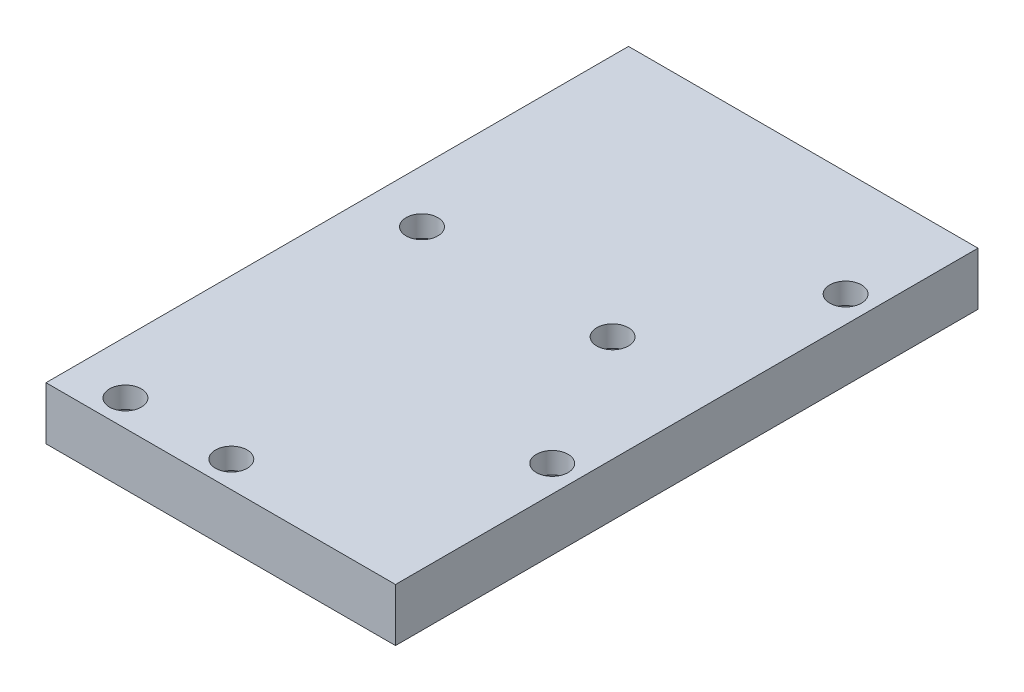
ISO-10303-21;
HEADER;
FILE_DESCRIPTION(('STEP AP214'),'2;1');
FILE_NAME('part.step','',(''),(''),'','','');
FILE_SCHEMA(('AUTOMOTIVE_DESIGN { 1 0 10303 214 1 1 1 1 }'));
ENDSEC;
DATA;
#1=APPLICATION_CONTEXT('core data for automotive mechanical design processes');
#2=APPLICATION_PROTOCOL_DEFINITION('international standard','automotive_design',2000,#1);
#3=PRODUCT_CONTEXT('',#1,'mechanical');
#4=PRODUCT('Part','Part','',(#3));
#5=PRODUCT_RELATED_PRODUCT_CATEGORY('part','',(#4));
#6=PRODUCT_DEFINITION_FORMATION('','',#4);
#7=PRODUCT_DEFINITION_CONTEXT('part definition',#1,'design');
#8=PRODUCT_DEFINITION('design','',#6,#7);
#9=PRODUCT_DEFINITION_SHAPE('','',#8);
#10=(LENGTH_UNIT() NAMED_UNIT(*) SI_UNIT(.MILLI.,.METRE.));
#11=(NAMED_UNIT(*) PLANE_ANGLE_UNIT() SI_UNIT($,.RADIAN.));
#12=(NAMED_UNIT(*) SI_UNIT($,.STERADIAN.) SOLID_ANGLE_UNIT());
#13=UNCERTAINTY_MEASURE_WITH_UNIT(LENGTH_MEASURE(1.E-05),#10,'distance_accuracy_value','');
#14=(GEOMETRIC_REPRESENTATION_CONTEXT(3) GLOBAL_UNCERTAINTY_ASSIGNED_CONTEXT((#13)) GLOBAL_UNIT_ASSIGNED_CONTEXT((#10,
#11,#12)) REPRESENTATION_CONTEXT('',''));
#15=CARTESIAN_POINT('',(0.,0.,0.));
#16=DIRECTION('',(0.,0.,1.));
#17=DIRECTION('',(1.,0.,0.));
#18=AXIS2_PLACEMENT_3D('',#15,#16,#17);
#19=CARTESIAN_POINT('',(0.,5.,0.));
#20=DIRECTION('',(0.,1.,0.));
#21=DIRECTION('',(0.,0.,1.));
#22=AXIS2_PLACEMENT_3D('',#19,#20,#21);
#23=PLANE('',#22);
#24=CARTESIAN_POINT('',(2.5,5.,10.));
#25=DIRECTION('',(0.,1.,0.));
#26=DIRECTION('',(0.,0.,1.));
#27=AXIS2_PLACEMENT_3D('',#24,#25,#26);
#28=CIRCLE('',#27,1.49999999999999);
#29=CARTESIAN_POINT('',(2.5,5.,11.5));
#30=VERTEX_POINT('',#29);
#31=EDGE_CURVE('E160',#30,#30,#28,.T.);
#32=ORIENTED_EDGE('',*,*,#31,.F.);
#33=EDGE_LOOP('',(#32));
#34=FACE_BOUND('',#33,.T.);
#35=CARTESIAN_POINT('',(2.5,5.,37.701964886511));
#36=DIRECTION('',(0.,1.,0.));
#37=DIRECTION('',(0.,0.,1.));
#38=AXIS2_PLACEMENT_3D('',#35,#36,#37);
#39=CIRCLE('',#38,1.5);
#40=CARTESIAN_POINT('',(2.5,5.,39.201964886511));
#41=VERTEX_POINT('',#40);
#42=EDGE_CURVE('E163',#41,#41,#39,.T.);
#43=ORIENTED_EDGE('',*,*,#42,.F.);
#44=EDGE_LOOP('',(#43));
#45=FACE_BOUND('',#44,.T.);
#46=CARTESIAN_POINT('',(-13.,5.,52.5));
#47=DIRECTION('',(0.,1.,0.));
#48=DIRECTION('',(0.,0.,1.));
#49=AXIS2_PLACEMENT_3D('',#46,#47,#48);
#50=CIRCLE('',#49,1.5);
#51=CARTESIAN_POINT('',(-13.,5.,54.));
#52=VERTEX_POINT('',#51);
#53=EDGE_CURVE('E179',#52,#52,#50,.T.);
#54=ORIENTED_EDGE('',*,*,#53,.F.);
#55=EDGE_LOOP('',(#54));
#56=FACE_BOUND('',#55,.T.);
#57=CARTESIAN_POINT('',(-5.,5.,24.5));
#58=DIRECTION('',(0.,1.,0.));
#59=DIRECTION('',(0.,0.,1.));
#60=AXIS2_PLACEMENT_3D('',#57,#58,#59);
#61=CIRCLE('',#60,1.5);
#62=CARTESIAN_POINT('',(-5.,5.,26.));
#63=VERTEX_POINT('',#62);
#64=EDGE_CURVE('E148',#63,#63,#61,.T.);
#65=ORIENTED_EDGE('',*,*,#64,.F.);
#66=EDGE_LOOP('',(#65));
#67=FACE_BOUND('',#66,.T.);
#68=DIRECTION('',(1.,0.,0.));
#69=VECTOR('',#68,1.);
#70=CARTESIAN_POINT('',(-28.,5.,55.));
#71=LINE('',#70,#69);
#72=CARTESIAN_POINT('',(-28.,5.,55.));
#73=VERTEX_POINT('',#72);
#74=CARTESIAN_POINT('',(5.,5.,55.));
#75=VERTEX_POINT('',#74);
#76=EDGE_CURVE('E128',#73,#75,#71,.T.);
#77=ORIENTED_EDGE('',*,*,#76,.T.);
#78=DIRECTION('',(0.,0.,1.));
#79=VECTOR('',#78,1.);
#80=CARTESIAN_POINT('',(5.,5.,55.));
#81=LINE('',#80,#79);
#82=CARTESIAN_POINT('',(5.,5.,0.));
#83=VERTEX_POINT('',#82);
#84=EDGE_CURVE('E159',#83,#75,#81,.T.);
#85=ORIENTED_EDGE('',*,*,#84,.F.);
#86=DIRECTION('',(1.,0.,0.));
#87=VECTOR('',#86,1.);
#88=CARTESIAN_POINT('',(-28.,5.,0.));
#89=LINE('',#88,#87);
#90=CARTESIAN_POINT('',(-28.,5.,0.));
#91=VERTEX_POINT('',#90);
#92=EDGE_CURVE('E189',#91,#83,#89,.T.);
#93=ORIENTED_EDGE('',*,*,#92,.F.);
#94=DIRECTION('',(0.,0.,-1.));
#95=VECTOR('',#94,1.);
#96=CARTESIAN_POINT('',(-28.,5.,55.));
#97=LINE('',#96,#95);
#98=EDGE_CURVE('E192',#73,#91,#97,.T.);
#99=ORIENTED_EDGE('',*,*,#98,.F.);
#100=EDGE_LOOP('',(#77,#85,#93,#99));
#101=FACE_BOUND('',#100,.T.);
#102=CARTESIAN_POINT('',(-23.,5.,24.5));
#103=DIRECTION('',(0.,1.,0.));
#104=DIRECTION('',(0.,0.,1.));
#105=AXIS2_PLACEMENT_3D('',#102,#103,#104);
#106=CIRCLE('',#105,1.5);
#107=CARTESIAN_POINT('',(-23.,5.,26.));
#108=VERTEX_POINT('',#107);
#109=EDGE_CURVE('E183',#108,#108,#106,.T.);
#110=ORIENTED_EDGE('',*,*,#109,.F.);
#111=EDGE_LOOP('',(#110));
#112=FACE_BOUND('',#111,.T.);
#113=CARTESIAN_POINT('',(-23.,5.,52.5));
#114=DIRECTION('',(0.,1.,0.));
#115=DIRECTION('',(0.,0.,1.));
#116=AXIS2_PLACEMENT_3D('',#113,#114,#115);
#117=CIRCLE('',#116,1.5);
#118=CARTESIAN_POINT('',(-23.,5.,54.));
#119=VERTEX_POINT('',#118);
#120=EDGE_CURVE('E176',#119,#119,#117,.T.);
#121=ORIENTED_EDGE('',*,*,#120,.F.);
#122=EDGE_LOOP('',(#121));
#123=FACE_BOUND('',#122,.T.);
#124=ADVANCED_FACE('F97',(#34,#45,#56,#67,#101,#112,#123),#23,.T.);
#125=CARTESIAN_POINT('',(0.,0.,0.));
#126=DIRECTION('',(0.,1.,0.));
#127=DIRECTION('',(0.,0.,1.));
#128=AXIS2_PLACEMENT_3D('',#125,#126,#127);
#129=PLANE('',#128);
#130=CARTESIAN_POINT('',(2.5,0.,10.));
#131=DIRECTION('',(0.,1.,0.));
#132=DIRECTION('',(0.,0.,1.));
#133=AXIS2_PLACEMENT_3D('',#130,#131,#132);
#134=CIRCLE('',#133,2.25);
#135=CARTESIAN_POINT('',(2.5,0.,12.25));
#136=VERTEX_POINT('',#135);
#137=EDGE_CURVE('E436',#136,#136,#134,.T.);
#138=ORIENTED_EDGE('',*,*,#137,.T.);
#139=EDGE_LOOP('',(#138));
#140=FACE_BOUND('',#139,.T.);
#141=CARTESIAN_POINT('',(-23.,0.,24.5));
#142=DIRECTION('',(0.,1.,0.));
#143=DIRECTION('',(0.,0.,1.));
#144=AXIS2_PLACEMENT_3D('',#141,#142,#143);
#145=CIRCLE('',#144,2.25);
#146=CARTESIAN_POINT('',(-23.,0.,26.75));
#147=VERTEX_POINT('',#146);
#148=EDGE_CURVE('E447',#147,#147,#145,.T.);
#149=ORIENTED_EDGE('',*,*,#148,.T.);
#150=EDGE_LOOP('',(#149));
#151=FACE_BOUND('',#150,.T.);
#152=CARTESIAN_POINT('',(-23.,0.,52.5));
#153=DIRECTION('',(0.,1.,0.));
#154=DIRECTION('',(0.,0.,1.));
#155=AXIS2_PLACEMENT_3D('',#152,#153,#154);
#156=CIRCLE('',#155,2.25);
#157=CARTESIAN_POINT('',(-23.,0.,54.75));
#158=VERTEX_POINT('',#157);
#159=EDGE_CURVE('E466',#158,#158,#156,.T.);
#160=ORIENTED_EDGE('',*,*,#159,.T.);
#161=EDGE_LOOP('',(#160));
#162=FACE_BOUND('',#161,.T.);
#163=CARTESIAN_POINT('',(-13.,0.,52.5));
#164=DIRECTION('',(0.,1.,0.));
#165=DIRECTION('',(0.,0.,1.));
#166=AXIS2_PLACEMENT_3D('',#163,#164,#165);
#167=CIRCLE('',#166,2.25);
#168=CARTESIAN_POINT('',(-13.,0.,54.75));
#169=VERTEX_POINT('',#168);
#170=EDGE_CURVE('E460',#169,#169,#167,.T.);
#171=ORIENTED_EDGE('',*,*,#170,.T.);
#172=EDGE_LOOP('',(#171));
#173=FACE_BOUND('',#172,.T.);
#174=CARTESIAN_POINT('',(2.5,0.,37.701964886511));
#175=DIRECTION('',(0.,1.,0.));
#176=DIRECTION('',(0.,0.,1.));
#177=AXIS2_PLACEMENT_3D('',#174,#175,#176);
#178=CIRCLE('',#177,2.25);
#179=CARTESIAN_POINT('',(2.5,0.,39.951964886511));
#180=VERTEX_POINT('',#179);
#181=EDGE_CURVE('E454',#180,#180,#178,.T.);
#182=ORIENTED_EDGE('',*,*,#181,.T.);
#183=EDGE_LOOP('',(#182));
#184=FACE_BOUND('',#183,.T.);
#185=CARTESIAN_POINT('',(-5.,0.,24.5));
#186=DIRECTION('',(0.,1.,0.));
#187=DIRECTION('',(0.,0.,1.));
#188=AXIS2_PLACEMENT_3D('',#185,#186,#187);
#189=CIRCLE('',#188,2.25);
#190=CARTESIAN_POINT('',(-5.,0.,26.75));
#191=VERTEX_POINT('',#190);
#192=EDGE_CURVE('E441',#191,#191,#189,.T.);
#193=ORIENTED_EDGE('',*,*,#192,.T.);
#194=EDGE_LOOP('',(#193));
#195=FACE_BOUND('',#194,.T.);
#196=DIRECTION('',(1.,0.,0.));
#197=VECTOR('',#196,1.);
#198=CARTESIAN_POINT('',(-28.,0.,55.));
#199=LINE('',#198,#197);
#200=CARTESIAN_POINT('',(-28.,0.,55.));
#201=VERTEX_POINT('',#200);
#202=CARTESIAN_POINT('',(5.,0.,55.));
#203=VERTEX_POINT('',#202);
#204=EDGE_CURVE('E141',#201,#203,#199,.T.);
#205=ORIENTED_EDGE('',*,*,#204,.F.);
#206=DIRECTION('',(0.,0.,-1.));
#207=VECTOR('',#206,1.);
#208=CARTESIAN_POINT('',(-28.,0.,55.));
#209=LINE('',#208,#207);
#210=CARTESIAN_POINT('',(-28.,0.,0.));
#211=VERTEX_POINT('',#210);
#212=EDGE_CURVE('E190',#201,#211,#209,.T.);
#213=ORIENTED_EDGE('',*,*,#212,.T.);
#214=DIRECTION('',(1.,0.,0.));
#215=VECTOR('',#214,1.);
#216=CARTESIAN_POINT('',(-28.,0.,0.));
#217=LINE('',#216,#215);
#218=CARTESIAN_POINT('',(5.,0.,0.));
#219=VERTEX_POINT('',#218);
#220=EDGE_CURVE('E147',#211,#219,#217,.T.);
#221=ORIENTED_EDGE('',*,*,#220,.T.);
#222=DIRECTION('',(0.,0.,-1.));
#223=VECTOR('',#222,1.);
#224=CARTESIAN_POINT('',(5.,0.,55.));
#225=LINE('',#224,#223);
#226=EDGE_CURVE('E151',#203,#219,#225,.T.);
#227=ORIENTED_EDGE('',*,*,#226,.F.);
#228=EDGE_LOOP('',(#205,#213,#221,#227));
#229=FACE_BOUND('',#228,.T.);
#230=ADVANCED_FACE('F152',(#140,#151,#162,#173,#184,#195,#229),#129,.F.);
#231=CARTESIAN_POINT('',(-28.,5.,55.));
#232=DIRECTION('',(0.,0.,-1.));
#233=DIRECTION('',(-1.,0.,0.));
#234=AXIS2_PLACEMENT_3D('',#231,#232,#233);
#235=PLANE('',#234);
#236=ORIENTED_EDGE('',*,*,#204,.T.);
#237=DIRECTION('',(0.,-1.,0.));
#238=VECTOR('',#237,1.);
#239=CARTESIAN_POINT('',(5.,5.,55.));
#240=LINE('',#239,#238);
#241=EDGE_CURVE('E144',#75,#203,#240,.T.);
#242=ORIENTED_EDGE('',*,*,#241,.F.);
#243=ORIENTED_EDGE('',*,*,#76,.F.);
#244=DIRECTION('',(0.,-1.,0.));
#245=VECTOR('',#244,1.);
#246=CARTESIAN_POINT('',(-28.,5.,55.));
#247=LINE('',#246,#245);
#248=EDGE_CURVE('E107',#73,#201,#247,.T.);
#249=ORIENTED_EDGE('',*,*,#248,.T.);
#250=EDGE_LOOP('',(#236,#242,#243,#249));
#251=FACE_BOUND('',#250,.T.);
#252=ADVANCED_FACE('F99',(#251),#235,.F.);
#253=CARTESIAN_POINT('',(-28.,5.,0.));
#254=DIRECTION('',(0.,0.,-1.));
#255=DIRECTION('',(-1.,0.,0.));
#256=AXIS2_PLACEMENT_3D('',#253,#254,#255);
#257=PLANE('',#256);
#258=ORIENTED_EDGE('',*,*,#220,.F.);
#259=DIRECTION('',(0.,-1.,0.));
#260=VECTOR('',#259,1.);
#261=CARTESIAN_POINT('',(-28.,5.,0.));
#262=LINE('',#261,#260);
#263=EDGE_CURVE('E13',#91,#211,#262,.T.);
#264=ORIENTED_EDGE('',*,*,#263,.F.);
#265=ORIENTED_EDGE('',*,*,#92,.T.);
#266=DIRECTION('',(0.,1.,0.));
#267=VECTOR('',#266,1.);
#268=CARTESIAN_POINT('',(5.,5.,0.));
#269=LINE('',#268,#267);
#270=EDGE_CURVE('E156',#219,#83,#269,.T.);
#271=ORIENTED_EDGE('',*,*,#270,.F.);
#272=EDGE_LOOP('',(#258,#264,#265,#271));
#273=FACE_BOUND('',#272,.T.);
#274=ADVANCED_FACE('F268',(#273),#257,.T.);
#275=CARTESIAN_POINT('',(-28.,5.,55.));
#276=DIRECTION('',(-1.,0.,0.));
#277=DIRECTION('',(0.,0.,1.));
#278=AXIS2_PLACEMENT_3D('',#275,#276,#277);
#279=PLANE('',#278);
#280=CARTESIAN_POINT('',(-28.,2.5,10.));
#281=DIRECTION('',(-1.,0.,0.));
#282=DIRECTION('',(0.,0.,1.));
#283=AXIS2_PLACEMENT_3D('',#280,#281,#282);
#284=CIRCLE('',#283,0.85);
#285=CARTESIAN_POINT('',(-28.,2.5,9.15));
#286=VERTEX_POINT('',#285);
#287=EDGE_CURVE('E180',#286,#286,#284,.F.);
#288=ORIENTED_EDGE('',*,*,#287,.T.);
#289=EDGE_LOOP('',(#288));
#290=FACE_BOUND('',#289,.T.);
#291=CARTESIAN_POINT('',(-28.,2.5,45.));
#292=DIRECTION('',(-1.,0.,0.));
#293=DIRECTION('',(0.,0.,1.));
#294=AXIS2_PLACEMENT_3D('',#291,#292,#293);
#295=CIRCLE('',#294,0.85);
#296=CARTESIAN_POINT('',(-28.,2.5,44.15));
#297=VERTEX_POINT('',#296);
#298=EDGE_CURVE('E173',#297,#297,#295,.F.);
#299=ORIENTED_EDGE('',*,*,#298,.T.);
#300=EDGE_LOOP('',(#299));
#301=FACE_BOUND('',#300,.T.);
#302=ORIENTED_EDGE('',*,*,#212,.F.);
#303=ORIENTED_EDGE('',*,*,#248,.F.);
#304=ORIENTED_EDGE('',*,*,#98,.T.);
#305=ORIENTED_EDGE('',*,*,#263,.T.);
#306=EDGE_LOOP('',(#302,#303,#304,#305));
#307=FACE_BOUND('',#306,.T.);
#308=ADVANCED_FACE('F261',(#290,#301,#307),#279,.T.);
#309=CARTESIAN_POINT('',(-5.,5.,24.5));
#310=DIRECTION('',(0.,-1.,0.));
#311=DIRECTION('',(0.,0.,-1.));
#312=AXIS2_PLACEMENT_3D('',#309,#310,#311);
#313=CYLINDRICAL_SURFACE('',#312,1.5);
#314=CARTESIAN_POINT('',(-5.,3.,24.5));
#315=DIRECTION('',(0.,1.,0.));
#316=DIRECTION('',(0.,0.,1.));
#317=AXIS2_PLACEMENT_3D('',#314,#315,#316);
#318=CIRCLE('',#317,1.5);
#319=CARTESIAN_POINT('',(-5.,3.,26.));
#320=VERTEX_POINT('',#319);
#321=EDGE_CURVE('E101',#320,#320,#318,.T.);
#322=ORIENTED_EDGE('',*,*,#321,.F.);
#323=EDGE_LOOP('',(#322));
#324=FACE_BOUND('',#323,.T.);
#325=ORIENTED_EDGE('',*,*,#64,.T.);
#326=EDGE_LOOP('',(#325));
#327=FACE_BOUND('',#326,.T.);
#328=ADVANCED_FACE('F258',(#324,#327),#313,.F.);
#329=CARTESIAN_POINT('',(-23.,5.,24.5));
#330=DIRECTION('',(0.,-1.,0.));
#331=DIRECTION('',(0.,0.,-1.));
#332=AXIS2_PLACEMENT_3D('',#329,#330,#331);
#333=CYLINDRICAL_SURFACE('',#332,1.5);
#334=CARTESIAN_POINT('',(-23.,3.,24.5));
#335=DIRECTION('',(0.,1.,0.));
#336=DIRECTION('',(0.,0.,1.));
#337=AXIS2_PLACEMENT_3D('',#334,#335,#336);
#338=CIRCLE('',#337,1.5);
#339=CARTESIAN_POINT('',(-23.,3.,26.));
#340=VERTEX_POINT('',#339);
#341=EDGE_CURVE('E213',#340,#340,#338,.T.);
#342=ORIENTED_EDGE('',*,*,#341,.F.);
#343=EDGE_LOOP('',(#342));
#344=FACE_BOUND('',#343,.T.);
#345=ORIENTED_EDGE('',*,*,#109,.T.);
#346=EDGE_LOOP('',(#345));
#347=FACE_BOUND('',#346,.T.);
#348=ADVANCED_FACE('F250',(#344,#347),#333,.F.);
#349=CARTESIAN_POINT('',(-13.,5.,52.5));
#350=DIRECTION('',(0.,-1.,0.));
#351=DIRECTION('',(0.,0.,-1.));
#352=AXIS2_PLACEMENT_3D('',#349,#350,#351);
#353=CYLINDRICAL_SURFACE('',#352,1.5);
#354=CARTESIAN_POINT('',(-13.,3.,52.5));
#355=DIRECTION('',(0.,1.,0.));
#356=DIRECTION('',(0.,0.,1.));
#357=AXIS2_PLACEMENT_3D('',#354,#355,#356);
#358=CIRCLE('',#357,1.5);
#359=CARTESIAN_POINT('',(-13.,3.,54.));
#360=VERTEX_POINT('',#359);
#361=EDGE_CURVE('E211',#360,#360,#358,.T.);
#362=ORIENTED_EDGE('',*,*,#361,.F.);
#363=EDGE_LOOP('',(#362));
#364=FACE_BOUND('',#363,.T.);
#365=ORIENTED_EDGE('',*,*,#53,.T.);
#366=EDGE_LOOP('',(#365));
#367=FACE_BOUND('',#366,.T.);
#368=ADVANCED_FACE('F240',(#364,#367),#353,.F.);
#369=CARTESIAN_POINT('',(-23.,5.,52.5));
#370=DIRECTION('',(0.,-1.,0.));
#371=DIRECTION('',(0.,0.,-1.));
#372=AXIS2_PLACEMENT_3D('',#369,#370,#371);
#373=CYLINDRICAL_SURFACE('',#372,1.5);
#374=CARTESIAN_POINT('',(-23.,3.,52.5));
#375=DIRECTION('',(0.,1.,0.));
#376=DIRECTION('',(0.,0.,1.));
#377=AXIS2_PLACEMENT_3D('',#374,#375,#376);
#378=CIRCLE('',#377,1.5);
#379=CARTESIAN_POINT('',(-23.,3.,54.));
#380=VERTEX_POINT('',#379);
#381=EDGE_CURVE('E208',#380,#380,#378,.T.);
#382=ORIENTED_EDGE('',*,*,#381,.F.);
#383=EDGE_LOOP('',(#382));
#384=FACE_BOUND('',#383,.T.);
#385=ORIENTED_EDGE('',*,*,#120,.T.);
#386=EDGE_LOOP('',(#385));
#387=FACE_BOUND('',#386,.T.);
#388=ADVANCED_FACE('F237',(#384,#387),#373,.F.);
#389=CARTESIAN_POINT('',(-28.000012,2.5,45.));
#390=DIRECTION('',(1.,0.,0.));
#391=DIRECTION('',(0.,0.,-1.));
#392=AXIS2_PLACEMENT_3D('',#389,#390,#391);
#393=CYLINDRICAL_SURFACE('',#392,0.85);
#394=CARTESIAN_POINT('',(-24.,2.5,45.));
#395=DIRECTION('',(-1.,0.,0.));
#396=DIRECTION('',(0.,0.,1.));
#397=AXIS2_PLACEMENT_3D('',#394,#395,#396);
#398=CIRCLE('',#397,0.85);
#399=CARTESIAN_POINT('',(-24.,2.5,44.15));
#400=VERTEX_POINT('',#399);
#401=EDGE_CURVE('E169',#400,#400,#398,.T.);
#402=CARTESIAN_POINT('',(-28.,2.5,44.15));
#403=CARTESIAN_POINT('',(-27.9583333333333,2.5,44.15));
#404=CARTESIAN_POINT('',(-27.9166666666667,2.5,44.15));
#405=CARTESIAN_POINT('',(-27.8333333333333,2.5,44.15));
#406=CARTESIAN_POINT('',(-27.7916666666667,2.5,44.15));
#407=CARTESIAN_POINT('',(-27.7083333333333,2.5,44.15));
#408=CARTESIAN_POINT('',(-27.6666666666667,2.5,44.15));
#409=CARTESIAN_POINT('',(-27.5833333333333,2.5,44.15));
#410=CARTESIAN_POINT('',(-27.5416666666667,2.5,44.15));
#411=CARTESIAN_POINT('',(-27.4583333333333,2.5,44.15));
#412=CARTESIAN_POINT('',(-27.4166666666667,2.5,44.15));
#413=CARTESIAN_POINT('',(-27.3333333333333,2.5,44.15));
#414=CARTESIAN_POINT('',(-27.2916666666667,2.5,44.15));
#415=CARTESIAN_POINT('',(-27.2083333333333,2.5,44.15));
#416=CARTESIAN_POINT('',(-27.1666666666667,2.5,44.15));
#417=CARTESIAN_POINT('',(-27.0833333333333,2.5,44.15));
#418=CARTESIAN_POINT('',(-27.0416666666667,2.5,44.15));
#419=CARTESIAN_POINT('',(-26.9583333333333,2.5,44.15));
#420=CARTESIAN_POINT('',(-26.9166666666667,2.5,44.15));
#421=CARTESIAN_POINT('',(-26.8333333333333,2.5,44.15));
#422=CARTESIAN_POINT('',(-26.7916666666667,2.5,44.15));
#423=CARTESIAN_POINT('',(-26.7083333333333,2.5,44.15));
#424=CARTESIAN_POINT('',(-26.6666666666667,2.5,44.15));
#425=CARTESIAN_POINT('',(-26.5833333333333,2.5,44.15));
#426=CARTESIAN_POINT('',(-26.5416666666667,2.5,44.15));
#427=CARTESIAN_POINT('',(-26.4583333333333,2.5,44.15));
#428=CARTESIAN_POINT('',(-26.4166666666667,2.5,44.15));
#429=CARTESIAN_POINT('',(-26.3333333333333,2.5,44.15));
#430=CARTESIAN_POINT('',(-26.2916666666667,2.5,44.15));
#431=CARTESIAN_POINT('',(-26.2083333333333,2.5,44.15));
#432=CARTESIAN_POINT('',(-26.1666666666667,2.5,44.15));
#433=CARTESIAN_POINT('',(-26.0833333333333,2.5,44.15));
#434=CARTESIAN_POINT('',(-26.0416666666667,2.5,44.15));
#435=CARTESIAN_POINT('',(-25.9583333333333,2.5,44.15));
#436=CARTESIAN_POINT('',(-25.9166666666667,2.5,44.15));
#437=CARTESIAN_POINT('',(-25.8333333333333,2.5,44.15));
#438=CARTESIAN_POINT('',(-25.7916666666667,2.5,44.15));
#439=CARTESIAN_POINT('',(-25.7083333333333,2.5,44.15));
#440=CARTESIAN_POINT('',(-25.6666666666667,2.5,44.15));
#441=CARTESIAN_POINT('',(-25.5833333333333,2.5,44.15));
#442=CARTESIAN_POINT('',(-25.5416666666667,2.5,44.15));
#443=CARTESIAN_POINT('',(-25.4583333333333,2.5,44.15));
#444=CARTESIAN_POINT('',(-25.4166666666667,2.5,44.15));
#445=CARTESIAN_POINT('',(-25.3333333333333,2.5,44.15));
#446=CARTESIAN_POINT('',(-25.2916666666667,2.5,44.15));
#447=CARTESIAN_POINT('',(-25.2083333333333,2.5,44.15));
#448=CARTESIAN_POINT('',(-25.1666666666667,2.5,44.15));
#449=CARTESIAN_POINT('',(-25.0833333333333,2.5,44.15));
#450=CARTESIAN_POINT('',(-25.0416666666667,2.5,44.15));
#451=CARTESIAN_POINT('',(-24.9583333333333,2.5,44.15));
#452=CARTESIAN_POINT('',(-24.9166666666667,2.5,44.15));
#453=CARTESIAN_POINT('',(-24.8333333333333,2.5,44.15));
#454=CARTESIAN_POINT('',(-24.7916666666667,2.5,44.15));
#455=CARTESIAN_POINT('',(-24.7083333333333,2.5,44.15));
#456=CARTESIAN_POINT('',(-24.6666666666667,2.5,44.15));
#457=CARTESIAN_POINT('',(-24.5833333333333,2.5,44.15));
#458=CARTESIAN_POINT('',(-24.5416666666667,2.5,44.15));
#459=CARTESIAN_POINT('',(-24.4583333333333,2.5,44.15));
#460=CARTESIAN_POINT('',(-24.4166666666667,2.5,44.15));
#461=CARTESIAN_POINT('',(-24.3333333333333,2.5,44.15));
#462=CARTESIAN_POINT('',(-24.2916666666667,2.5,44.15));
#463=CARTESIAN_POINT('',(-24.2083333333333,2.5,44.15));
#464=CARTESIAN_POINT('',(-24.1666666666667,2.5,44.15));
#465=CARTESIAN_POINT('',(-24.0833333333333,2.5,44.15));
#466=CARTESIAN_POINT('',(-24.0416666666667,2.5,44.15));
#467=CARTESIAN_POINT('',(-24.,2.5,44.15));
#468=B_SPLINE_CURVE_WITH_KNOTS('',3,(#402,#403,#404,#405,#406,#407,#408,#409,#410,#411,#412,
#413,#414,#415,#416,#417,#418,#419,#420,#421,#422,#423,#424,#425,#426,#427,#428,#429,#430,#431,
#432,#433,#434,#435,#436,#437,#438,#439,#440,#441,#442,#443,#444,#445,#446,#447,#448,#449,#450,
#451,#452,#453,#454,#455,#456,#457,#458,#459,#460,#461,#462,#463,#464,#465,#466,#467),
.UNSPECIFIED.,.F.,.F.,(4,2,2,2,2,2,2,2,2,2,2,2,2,2,2,2,2,2,2,2,2,2,2,2,2,2,2,2,2,2,2,2,4),(0.,
0.124999999999997,0.249999999999997,0.374999999999997,0.499999999999997,0.624999999999997,
0.749999999999997,0.874999999999997,0.999999999999997,1.125,1.25,1.375,1.5,1.625,1.75,1.875,2.,
2.125,2.25,2.375,2.5,2.625,2.75,2.875,3.,3.125,3.25,3.375,3.5,3.625,3.75,3.875,4.),.UNSPECIFIED.);
#469=EDGE_CURVE('BSEAM239',#297,#400,#468,.T.);
#470=ORIENTED_EDGE('',*,*,#298,.F.);
#471=ORIENTED_EDGE('',*,*,#401,.F.);
#472=ORIENTED_EDGE('',*,*,#469,.T.);
#473=ORIENTED_EDGE('',*,*,#469,.F.);
#474=EDGE_LOOP('',(#470,#472,#471,#473));
#475=FACE_BOUND('',#474,.T.);
#476=ADVANCED_FACE('F239',(#475),#393,.F.);
#477=CARTESIAN_POINT('',(-24.,2.5,45.));
#478=DIRECTION('',(-1.,0.,0.));
#479=DIRECTION('',(0.,0.,1.));
#480=AXIS2_PLACEMENT_3D('',#477,#478,#479);
#481=PLANE('',#480);
#482=ORIENTED_EDGE('',*,*,#401,.T.);
#483=EDGE_LOOP('',(#482));
#484=FACE_BOUND('',#483,.T.);
#485=ADVANCED_FACE('F247',(#484),#481,.T.);
#486=CARTESIAN_POINT('',(-28.000012,2.5,10.));
#487=DIRECTION('',(1.,0.,0.));
#488=DIRECTION('',(0.,0.,-1.));
#489=AXIS2_PLACEMENT_3D('',#486,#487,#488);
#490=CYLINDRICAL_SURFACE('',#489,0.85);
#491=CARTESIAN_POINT('',(-24.,2.5,10.));
#492=DIRECTION('',(-1.,0.,0.));
#493=DIRECTION('',(0.,0.,1.));
#494=AXIS2_PLACEMENT_3D('',#491,#492,#493);
#495=CIRCLE('',#494,0.85);
#496=CARTESIAN_POINT('',(-24.,2.5,9.15));
#497=VERTEX_POINT('',#496);
#498=EDGE_CURVE('E170',#497,#497,#495,.T.);
#499=CARTESIAN_POINT('',(-28.,2.5,9.15));
#500=CARTESIAN_POINT('',(-27.9583333333333,2.5,9.15));
#501=CARTESIAN_POINT('',(-27.9166666666667,2.5,9.15));
#502=CARTESIAN_POINT('',(-27.8333333333333,2.5,9.15));
#503=CARTESIAN_POINT('',(-27.7916666666667,2.5,9.15));
#504=CARTESIAN_POINT('',(-27.7083333333333,2.5,9.15));
#505=CARTESIAN_POINT('',(-27.6666666666667,2.5,9.15));
#506=CARTESIAN_POINT('',(-27.5833333333333,2.5,9.15));
#507=CARTESIAN_POINT('',(-27.5416666666667,2.5,9.15));
#508=CARTESIAN_POINT('',(-27.4583333333333,2.5,9.15));
#509=CARTESIAN_POINT('',(-27.4166666666667,2.5,9.15));
#510=CARTESIAN_POINT('',(-27.3333333333333,2.5,9.15));
#511=CARTESIAN_POINT('',(-27.2916666666667,2.5,9.15));
#512=CARTESIAN_POINT('',(-27.2083333333333,2.5,9.15));
#513=CARTESIAN_POINT('',(-27.1666666666667,2.5,9.15));
#514=CARTESIAN_POINT('',(-27.0833333333333,2.5,9.15));
#515=CARTESIAN_POINT('',(-27.0416666666667,2.5,9.15));
#516=CARTESIAN_POINT('',(-26.9583333333333,2.5,9.15));
#517=CARTESIAN_POINT('',(-26.9166666666667,2.5,9.15));
#518=CARTESIAN_POINT('',(-26.8333333333333,2.5,9.15));
#519=CARTESIAN_POINT('',(-26.7916666666667,2.5,9.15));
#520=CARTESIAN_POINT('',(-26.7083333333333,2.5,9.15));
#521=CARTESIAN_POINT('',(-26.6666666666667,2.5,9.15));
#522=CARTESIAN_POINT('',(-26.5833333333333,2.5,9.15));
#523=CARTESIAN_POINT('',(-26.5416666666667,2.5,9.15));
#524=CARTESIAN_POINT('',(-26.4583333333333,2.5,9.15));
#525=CARTESIAN_POINT('',(-26.4166666666667,2.5,9.15));
#526=CARTESIAN_POINT('',(-26.3333333333333,2.5,9.15));
#527=CARTESIAN_POINT('',(-26.2916666666667,2.5,9.15));
#528=CARTESIAN_POINT('',(-26.2083333333333,2.5,9.15));
#529=CARTESIAN_POINT('',(-26.1666666666667,2.5,9.15));
#530=CARTESIAN_POINT('',(-26.0833333333333,2.5,9.15));
#531=CARTESIAN_POINT('',(-26.0416666666667,2.5,9.15));
#532=CARTESIAN_POINT('',(-25.9583333333333,2.5,9.15));
#533=CARTESIAN_POINT('',(-25.9166666666667,2.5,9.15));
#534=CARTESIAN_POINT('',(-25.8333333333333,2.5,9.15));
#535=CARTESIAN_POINT('',(-25.7916666666667,2.5,9.15));
#536=CARTESIAN_POINT('',(-25.7083333333333,2.5,9.15));
#537=CARTESIAN_POINT('',(-25.6666666666667,2.5,9.15));
#538=CARTESIAN_POINT('',(-25.5833333333333,2.5,9.15));
#539=CARTESIAN_POINT('',(-25.5416666666667,2.5,9.15));
#540=CARTESIAN_POINT('',(-25.4583333333333,2.5,9.15));
#541=CARTESIAN_POINT('',(-25.4166666666667,2.5,9.15));
#542=CARTESIAN_POINT('',(-25.3333333333333,2.5,9.15));
#543=CARTESIAN_POINT('',(-25.2916666666667,2.5,9.15));
#544=CARTESIAN_POINT('',(-25.2083333333333,2.5,9.15));
#545=CARTESIAN_POINT('',(-25.1666666666667,2.5,9.15));
#546=CARTESIAN_POINT('',(-25.0833333333333,2.5,9.15));
#547=CARTESIAN_POINT('',(-25.0416666666667,2.5,9.15));
#548=CARTESIAN_POINT('',(-24.9583333333333,2.5,9.15));
#549=CARTESIAN_POINT('',(-24.9166666666667,2.5,9.15));
#550=CARTESIAN_POINT('',(-24.8333333333333,2.5,9.15));
#551=CARTESIAN_POINT('',(-24.7916666666667,2.5,9.15));
#552=CARTESIAN_POINT('',(-24.7083333333333,2.5,9.15));
#553=CARTESIAN_POINT('',(-24.6666666666667,2.5,9.15));
#554=CARTESIAN_POINT('',(-24.5833333333333,2.5,9.15));
#555=CARTESIAN_POINT('',(-24.5416666666667,2.5,9.15));
#556=CARTESIAN_POINT('',(-24.4583333333333,2.5,9.15));
#557=CARTESIAN_POINT('',(-24.4166666666667,2.5,9.15));
#558=CARTESIAN_POINT('',(-24.3333333333333,2.5,9.15));
#559=CARTESIAN_POINT('',(-24.2916666666667,2.5,9.15));
#560=CARTESIAN_POINT('',(-24.2083333333333,2.5,9.15));
#561=CARTESIAN_POINT('',(-24.1666666666667,2.5,9.15));
#562=CARTESIAN_POINT('',(-24.0833333333333,2.5,9.15));
#563=CARTESIAN_POINT('',(-24.0416666666667,2.5,9.15));
#564=CARTESIAN_POINT('',(-24.,2.5,9.15));
#565=B_SPLINE_CURVE_WITH_KNOTS('',3,(#499,#500,#501,#502,#503,#504,#505,#506,#507,#508,#509,
#510,#511,#512,#513,#514,#515,#516,#517,#518,#519,#520,#521,#522,#523,#524,#525,#526,#527,#528,
#529,#530,#531,#532,#533,#534,#535,#536,#537,#538,#539,#540,#541,#542,#543,#544,#545,#546,#547,
#548,#549,#550,#551,#552,#553,#554,#555,#556,#557,#558,#559,#560,#561,#562,#563,#564),
.UNSPECIFIED.,.F.,.F.,(4,2,2,2,2,2,2,2,2,2,2,2,2,2,2,2,2,2,2,2,2,2,2,2,2,2,2,2,2,2,2,2,4),(0.,
0.124999999999997,0.249999999999997,0.374999999999997,0.499999999999997,0.624999999999997,
0.749999999999997,0.874999999999997,0.999999999999997,1.125,1.25,1.375,1.5,1.625,1.75,1.875,2.,
2.125,2.25,2.375,2.5,2.625,2.75,2.875,3.,3.125,3.25,3.375,3.5,3.625,3.75,3.875,4.),.UNSPECIFIED.);
#566=EDGE_CURVE('BSEAM360',#286,#497,#565,.T.);
#567=ORIENTED_EDGE('',*,*,#287,.F.);
#568=ORIENTED_EDGE('',*,*,#498,.F.);
#569=ORIENTED_EDGE('',*,*,#566,.T.);
#570=ORIENTED_EDGE('',*,*,#566,.F.);
#571=EDGE_LOOP('',(#567,#569,#568,#570));
#572=FACE_BOUND('',#571,.T.);
#573=ADVANCED_FACE('F360',(#572),#490,.F.);
#574=CARTESIAN_POINT('',(-24.,2.5,10.));
#575=DIRECTION('',(-1.,0.,0.));
#576=DIRECTION('',(0.,0.,1.));
#577=AXIS2_PLACEMENT_3D('',#574,#575,#576);
#578=PLANE('',#577);
#579=ORIENTED_EDGE('',*,*,#498,.T.);
#580=EDGE_LOOP('',(#579));
#581=FACE_BOUND('',#580,.T.);
#582=ADVANCED_FACE('F298',(#581),#578,.T.);
#583=CARTESIAN_POINT('',(5.,0.,0.));
#584=DIRECTION('',(1.,0.,0.));
#585=DIRECTION('',(0.,0.,-1.));
#586=AXIS2_PLACEMENT_3D('',#583,#584,#585);
#587=PLANE('',#586);
#588=ORIENTED_EDGE('',*,*,#241,.T.);
#589=ORIENTED_EDGE('',*,*,#226,.T.);
#590=ORIENTED_EDGE('',*,*,#270,.T.);
#591=ORIENTED_EDGE('',*,*,#84,.T.);
#592=EDGE_LOOP('',(#588,#589,#590,#591));
#593=FACE_BOUND('',#592,.T.);
#594=ADVANCED_FACE('F158',(#593),#587,.T.);
#595=CARTESIAN_POINT('',(2.5,5.,37.701964886511));
#596=DIRECTION('',(0.,-1.,0.));
#597=DIRECTION('',(0.,0.,-1.));
#598=AXIS2_PLACEMENT_3D('',#595,#596,#597);
#599=CYLINDRICAL_SURFACE('',#598,1.5);
#600=CARTESIAN_POINT('',(2.5,3.,37.701964886511));
#601=DIRECTION('',(0.,1.,0.));
#602=DIRECTION('',(0.,0.,1.));
#603=AXIS2_PLACEMENT_3D('',#600,#601,#602);
#604=CIRCLE('',#603,1.5);
#605=CARTESIAN_POINT('',(2.5,3.,39.201964886511));
#606=VERTEX_POINT('',#605);
#607=EDGE_CURVE('E204',#606,#606,#604,.T.);
#608=ORIENTED_EDGE('',*,*,#607,.F.);
#609=EDGE_LOOP('',(#608));
#610=FACE_BOUND('',#609,.T.);
#611=ORIENTED_EDGE('',*,*,#42,.T.);
#612=EDGE_LOOP('',(#611));
#613=FACE_BOUND('',#612,.T.);
#614=ADVANCED_FACE('F223',(#610,#613),#599,.F.);
#615=CARTESIAN_POINT('',(2.5,5.,10.));
#616=DIRECTION('',(0.,-1.,0.));
#617=DIRECTION('',(0.,0.,-1.));
#618=AXIS2_PLACEMENT_3D('',#615,#616,#617);
#619=CYLINDRICAL_SURFACE('',#618,1.49999999999999);
#620=CARTESIAN_POINT('',(2.5,3.,10.));
#621=DIRECTION('',(0.,1.,0.));
#622=DIRECTION('',(0.,0.,1.));
#623=AXIS2_PLACEMENT_3D('',#620,#621,#622);
#624=CIRCLE('',#623,1.49999999999999);
#625=CARTESIAN_POINT('',(2.5,3.,11.5));
#626=VERTEX_POINT('',#625);
#627=EDGE_CURVE('E201',#626,#626,#624,.T.);
#628=ORIENTED_EDGE('',*,*,#627,.F.);
#629=EDGE_LOOP('',(#628));
#630=FACE_BOUND('',#629,.T.);
#631=ORIENTED_EDGE('',*,*,#31,.T.);
#632=EDGE_LOOP('',(#631));
#633=FACE_BOUND('',#632,.T.);
#634=ADVANCED_FACE('F381',(#630,#633),#619,.F.);
#635=CARTESIAN_POINT('',(2.5,11.3639610306789,10.));
#636=DIRECTION('',(0.,-1.,0.));
#637=DIRECTION('',(0.,0.,-1.));
#638=AXIS2_PLACEMENT_3D('',#635,#636,#637);
#639=CYLINDRICAL_SURFACE('',#638,2.25);
#640=ORIENTED_EDGE('',*,*,#137,.F.);
#641=EDGE_LOOP('',(#640));
#642=FACE_BOUND('',#641,.T.);
#643=CARTESIAN_POINT('',(2.5,3.,10.));
#644=DIRECTION('',(0.,1.,0.));
#645=DIRECTION('',(0.,0.,1.));
#646=AXIS2_PLACEMENT_3D('',#643,#644,#645);
#647=CIRCLE('',#646,2.25);
#648=CARTESIAN_POINT('',(2.5,3.,12.25));
#649=VERTEX_POINT('',#648);
#650=EDGE_CURVE('E205',#649,#649,#647,.T.);
#651=ORIENTED_EDGE('',*,*,#650,.T.);
#652=EDGE_LOOP('',(#651));
#653=FACE_BOUND('',#652,.T.);
#654=ADVANCED_FACE('F385',(#642,#653),#639,.F.);
#655=CARTESIAN_POINT('',(0.,3.,0.));
#656=DIRECTION('',(0.,1.,0.));
#657=DIRECTION('',(0.,0.,1.));
#658=AXIS2_PLACEMENT_3D('',#655,#656,#657);
#659=PLANE('',#658);
#660=ORIENTED_EDGE('',*,*,#627,.T.);
#661=EDGE_LOOP('',(#660));
#662=FACE_BOUND('',#661,.T.);
#663=ORIENTED_EDGE('',*,*,#650,.F.);
#664=EDGE_LOOP('',(#663));
#665=FACE_BOUND('',#664,.T.);
#666=ADVANCED_FACE('F408',(#662,#665),#659,.F.);
#667=CARTESIAN_POINT('',(2.5,11.3639610306789,37.701964886511));
#668=DIRECTION('',(0.,-1.,0.));
#669=DIRECTION('',(0.,0.,-1.));
#670=AXIS2_PLACEMENT_3D('',#667,#668,#669);
#671=CYLINDRICAL_SURFACE('',#670,2.25);
#672=ORIENTED_EDGE('',*,*,#181,.F.);
#673=EDGE_LOOP('',(#672));
#674=FACE_BOUND('',#673,.T.);
#675=CARTESIAN_POINT('',(2.5,3.,37.701964886511));
#676=DIRECTION('',(0.,1.,0.));
#677=DIRECTION('',(0.,0.,1.));
#678=AXIS2_PLACEMENT_3D('',#675,#676,#677);
#679=CIRCLE('',#678,2.25);
#680=CARTESIAN_POINT('',(2.5,3.,39.951964886511));
#681=VERTEX_POINT('',#680);
#682=EDGE_CURVE('E457',#681,#681,#679,.T.);
#683=ORIENTED_EDGE('',*,*,#682,.T.);
#684=EDGE_LOOP('',(#683));
#685=FACE_BOUND('',#684,.T.);
#686=ADVANCED_FACE('F405',(#674,#685),#671,.F.);
#687=CARTESIAN_POINT('',(0.,3.,0.));
#688=DIRECTION('',(0.,1.,0.));
#689=DIRECTION('',(0.,0.,1.));
#690=AXIS2_PLACEMENT_3D('',#687,#688,#689);
#691=PLANE('',#690);
#692=ORIENTED_EDGE('',*,*,#607,.T.);
#693=EDGE_LOOP('',(#692));
#694=FACE_BOUND('',#693,.T.);
#695=ORIENTED_EDGE('',*,*,#682,.F.);
#696=EDGE_LOOP('',(#695));
#697=FACE_BOUND('',#696,.T.);
#698=ADVANCED_FACE('F391',(#694,#697),#691,.F.);
#699=CARTESIAN_POINT('',(-23.,11.3639610306789,52.5));
#700=DIRECTION('',(0.,-1.,0.));
#701=DIRECTION('',(0.,0.,-1.));
#702=AXIS2_PLACEMENT_3D('',#699,#700,#701);
#703=CYLINDRICAL_SURFACE('',#702,2.25);
#704=ORIENTED_EDGE('',*,*,#159,.F.);
#705=EDGE_LOOP('',(#704));
#706=FACE_BOUND('',#705,.T.);
#707=CARTESIAN_POINT('',(-23.,3.,52.5));
#708=DIRECTION('',(0.,1.,0.));
#709=DIRECTION('',(0.,0.,1.));
#710=AXIS2_PLACEMENT_3D('',#707,#708,#709);
#711=CIRCLE('',#710,2.25);
#712=CARTESIAN_POINT('',(-23.,3.,54.75));
#713=VERTEX_POINT('',#712);
#714=EDGE_CURVE('E450',#713,#713,#711,.T.);
#715=ORIENTED_EDGE('',*,*,#714,.T.);
#716=EDGE_LOOP('',(#715));
#717=FACE_BOUND('',#716,.T.);
#718=ADVANCED_FACE('F387',(#706,#717),#703,.F.);
#719=CARTESIAN_POINT('',(0.,3.,0.));
#720=DIRECTION('',(0.,1.,0.));
#721=DIRECTION('',(0.,0.,1.));
#722=AXIS2_PLACEMENT_3D('',#719,#720,#721);
#723=PLANE('',#722);
#724=ORIENTED_EDGE('',*,*,#381,.T.);
#725=EDGE_LOOP('',(#724));
#726=FACE_BOUND('',#725,.T.);
#727=ORIENTED_EDGE('',*,*,#714,.F.);
#728=EDGE_LOOP('',(#727));
#729=FACE_BOUND('',#728,.T.);
#730=ADVANCED_FACE('F390',(#726,#729),#723,.F.);
#731=CARTESIAN_POINT('',(-13.,11.3639610306789,52.5));
#732=DIRECTION('',(0.,-1.,0.));
#733=DIRECTION('',(0.,0.,-1.));
#734=AXIS2_PLACEMENT_3D('',#731,#732,#733);
#735=CYLINDRICAL_SURFACE('',#734,2.25);
#736=ORIENTED_EDGE('',*,*,#170,.F.);
#737=EDGE_LOOP('',(#736));
#738=FACE_BOUND('',#737,.T.);
#739=CARTESIAN_POINT('',(-13.,3.,52.5));
#740=DIRECTION('',(0.,1.,0.));
#741=DIRECTION('',(0.,0.,1.));
#742=AXIS2_PLACEMENT_3D('',#739,#740,#741);
#743=CIRCLE('',#742,2.25);
#744=CARTESIAN_POINT('',(-13.,3.,54.75));
#745=VERTEX_POINT('',#744);
#746=EDGE_CURVE('E463',#745,#745,#743,.T.);
#747=ORIENTED_EDGE('',*,*,#746,.T.);
#748=EDGE_LOOP('',(#747));
#749=FACE_BOUND('',#748,.T.);
#750=ADVANCED_FACE('F395',(#738,#749),#735,.F.);
#751=CARTESIAN_POINT('',(0.,3.,0.));
#752=DIRECTION('',(0.,1.,0.));
#753=DIRECTION('',(0.,0.,1.));
#754=AXIS2_PLACEMENT_3D('',#751,#752,#753);
#755=PLANE('',#754);
#756=ORIENTED_EDGE('',*,*,#361,.T.);
#757=EDGE_LOOP('',(#756));
#758=FACE_BOUND('',#757,.T.);
#759=ORIENTED_EDGE('',*,*,#746,.F.);
#760=EDGE_LOOP('',(#759));
#761=FACE_BOUND('',#760,.T.);
#762=ADVANCED_FACE('F399',(#758,#761),#755,.F.);
#763=CARTESIAN_POINT('',(-23.,11.3639610306789,24.5));
#764=DIRECTION('',(0.,-1.,0.));
#765=DIRECTION('',(0.,0.,-1.));
#766=AXIS2_PLACEMENT_3D('',#763,#764,#765);
#767=CYLINDRICAL_SURFACE('',#766,2.25);
#768=ORIENTED_EDGE('',*,*,#148,.F.);
#769=EDGE_LOOP('',(#768));
#770=FACE_BOUND('',#769,.T.);
#771=CARTESIAN_POINT('',(-23.,3.,24.5));
#772=DIRECTION('',(0.,1.,0.));
#773=DIRECTION('',(0.,0.,1.));
#774=AXIS2_PLACEMENT_3D('',#771,#772,#773);
#775=CIRCLE('',#774,2.25);
#776=CARTESIAN_POINT('',(-23.,3.,26.75));
#777=VERTEX_POINT('',#776);
#778=EDGE_CURVE('E444',#777,#777,#775,.T.);
#779=ORIENTED_EDGE('',*,*,#778,.T.);
#780=EDGE_LOOP('',(#779));
#781=FACE_BOUND('',#780,.T.);
#782=ADVANCED_FACE('F403',(#770,#781),#767,.F.);
#783=CARTESIAN_POINT('',(0.,3.,0.));
#784=DIRECTION('',(0.,1.,0.));
#785=DIRECTION('',(0.,0.,1.));
#786=AXIS2_PLACEMENT_3D('',#783,#784,#785);
#787=PLANE('',#786);
#788=ORIENTED_EDGE('',*,*,#341,.T.);
#789=EDGE_LOOP('',(#788));
#790=FACE_BOUND('',#789,.T.);
#791=ORIENTED_EDGE('',*,*,#778,.F.);
#792=EDGE_LOOP('',(#791));
#793=FACE_BOUND('',#792,.T.);
#794=ADVANCED_FACE('F417',(#790,#793),#787,.F.);
#795=CARTESIAN_POINT('',(-5.,11.3639610306789,24.5));
#796=DIRECTION('',(0.,-1.,0.));
#797=DIRECTION('',(0.,0.,-1.));
#798=AXIS2_PLACEMENT_3D('',#795,#796,#797);
#799=CYLINDRICAL_SURFACE('',#798,2.25);
#800=ORIENTED_EDGE('',*,*,#192,.F.);
#801=EDGE_LOOP('',(#800));
#802=FACE_BOUND('',#801,.T.);
#803=CARTESIAN_POINT('',(-5.,3.,24.5));
#804=DIRECTION('',(0.,1.,0.));
#805=DIRECTION('',(0.,0.,1.));
#806=AXIS2_PLACEMENT_3D('',#803,#804,#805);
#807=CIRCLE('',#806,2.25);
#808=CARTESIAN_POINT('',(-5.,3.,26.75));
#809=VERTEX_POINT('',#808);
#810=EDGE_CURVE('E451',#809,#809,#807,.T.);
#811=ORIENTED_EDGE('',*,*,#810,.T.);
#812=EDGE_LOOP('',(#811));
#813=FACE_BOUND('',#812,.T.);
#814=ADVANCED_FACE('F413',(#802,#813),#799,.F.);
#815=CARTESIAN_POINT('',(0.,3.,0.));
#816=DIRECTION('',(0.,1.,0.));
#817=DIRECTION('',(0.,0.,1.));
#818=AXIS2_PLACEMENT_3D('',#815,#816,#817);
#819=PLANE('',#818);
#820=ORIENTED_EDGE('',*,*,#321,.T.);
#821=EDGE_LOOP('',(#820));
#822=FACE_BOUND('',#821,.T.);
#823=ORIENTED_EDGE('',*,*,#810,.F.);
#824=EDGE_LOOP('',(#823));
#825=FACE_BOUND('',#824,.T.);
#826=ADVANCED_FACE('F416',(#822,#825),#819,.F.);
#827=CLOSED_SHELL('',(#124,#230,#252,#274,#308,#328,#348,#368,#388,#476,#485,#573,#582,#594,
#614,#634,#654,#666,#686,#698,#718,#730,#750,#762,#782,#794,#814,#826));
#828=MANIFOLD_SOLID_BREP('B2',#827);
#829=ADVANCED_BREP_SHAPE_REPRESENTATION('',(#18,#828),#14);
#830=SHAPE_DEFINITION_REPRESENTATION(#9,#829);
ENDSEC;
END-ISO-10303-21;
